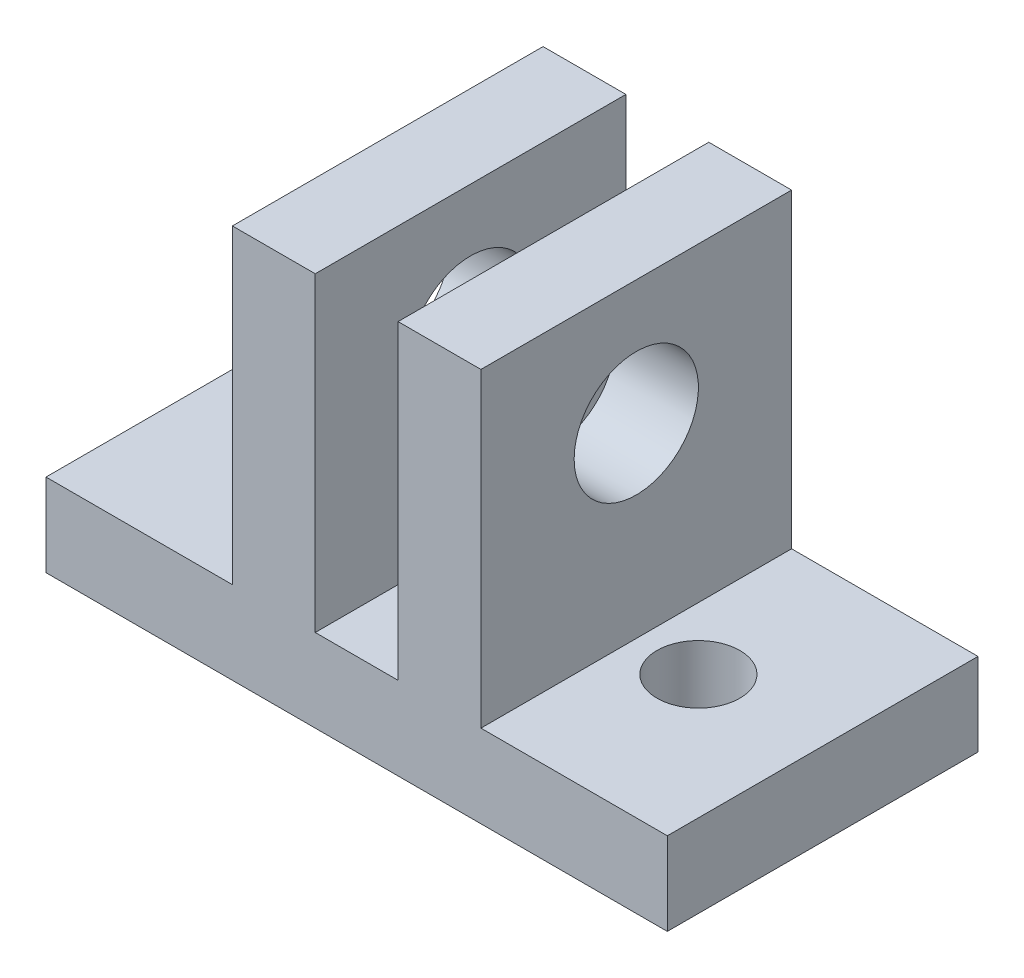
ISO-10303-21;
HEADER;
FILE_DESCRIPTION(('STEP AP214'),'2;1');
FILE_NAME('part.step','',(''),(''),'','','');
FILE_SCHEMA(('AUTOMOTIVE_DESIGN { 1 0 10303 214 1 1 1 1 }'));
ENDSEC;
DATA;
#1=APPLICATION_CONTEXT('core data for automotive mechanical design processes');
#2=APPLICATION_PROTOCOL_DEFINITION('international standard','automotive_design',2000,#1);
#3=PRODUCT_CONTEXT('',#1,'mechanical');
#4=PRODUCT('Part','Part','',(#3));
#5=PRODUCT_RELATED_PRODUCT_CATEGORY('part','',(#4));
#6=PRODUCT_DEFINITION_FORMATION('','',#4);
#7=PRODUCT_DEFINITION_CONTEXT('part definition',#1,'design');
#8=PRODUCT_DEFINITION('design','',#6,#7);
#9=PRODUCT_DEFINITION_SHAPE('','',#8);
#10=(LENGTH_UNIT() NAMED_UNIT(*) SI_UNIT(.MILLI.,.METRE.));
#11=(NAMED_UNIT(*) PLANE_ANGLE_UNIT() SI_UNIT($,.RADIAN.));
#12=(NAMED_UNIT(*) SI_UNIT($,.STERADIAN.) SOLID_ANGLE_UNIT());
#13=UNCERTAINTY_MEASURE_WITH_UNIT(LENGTH_MEASURE(1.E-05),#10,'distance_accuracy_value','');
#14=(GEOMETRIC_REPRESENTATION_CONTEXT(3) GLOBAL_UNCERTAINTY_ASSIGNED_CONTEXT((#13)) GLOBAL_UNIT_ASSIGNED_CONTEXT((#10,
#11,#12)) REPRESENTATION_CONTEXT('',''));
#15=CARTESIAN_POINT('',(0.,0.,0.));
#16=DIRECTION('',(0.,0.,1.));
#17=DIRECTION('',(1.,0.,0.));
#18=AXIS2_PLACEMENT_3D('',#15,#16,#17);
#19=CARTESIAN_POINT('',(0.,4.,0.));
#20=DIRECTION('',(0.,-1.,0.));
#21=DIRECTION('',(0.,0.,-1.));
#22=AXIS2_PLACEMENT_3D('',#19,#20,#21);
#23=PLANE('',#22);
#24=DIRECTION('',(0.,0.,1.));
#25=VECTOR('',#24,1.);
#26=CARTESIAN_POINT('',(17.,4.,-15.));
#27=LINE('',#26,#25);
#28=CARTESIAN_POINT('',(17.,4.,-15.));
#29=VERTEX_POINT('',#28);
#30=CARTESIAN_POINT('',(17.,4.,0.));
#31=VERTEX_POINT('',#30);
#32=EDGE_CURVE('E148',#29,#31,#27,.T.);
#33=ORIENTED_EDGE('',*,*,#32,.F.);
#34=DIRECTION('',(-1.,0.,0.));
#35=VECTOR('',#34,1.);
#36=CARTESIAN_POINT('',(0.,4.,-15.));
#37=LINE('',#36,#35);
#38=CARTESIAN_POINT('',(13.,4.,-15.));
#39=VERTEX_POINT('',#38);
#40=EDGE_CURVE('E181',#29,#39,#37,.T.);
#41=ORIENTED_EDGE('',*,*,#40,.T.);
#42=DIRECTION('',(0.,0.,-1.));
#43=VECTOR('',#42,1.);
#44=CARTESIAN_POINT('',(13.,4.,-15.));
#45=LINE('',#44,#43);
#46=CARTESIAN_POINT('',(13.,4.,0.));
#47=VERTEX_POINT('',#46);
#48=EDGE_CURVE('E152',#47,#39,#45,.T.);
#49=ORIENTED_EDGE('',*,*,#48,.F.);
#50=DIRECTION('',(1.,0.,0.));
#51=VECTOR('',#50,1.);
#52=CARTESIAN_POINT('',(0.,4.,0.));
#53=LINE('',#52,#51);
#54=EDGE_CURVE('E60',#47,#31,#53,.T.);
#55=ORIENTED_EDGE('',*,*,#54,.T.);
#56=EDGE_LOOP('',(#33,#41,#49,#55));
#57=FACE_BOUND('',#56,.T.);
#58=ADVANCED_FACE('F35',(#57),#23,.F.);
#59=CARTESIAN_POINT('',(24.,4.,-7.5));
#60=DIRECTION('',(0.,-1.,0.));
#61=DIRECTION('',(0.,0.,-1.));
#62=AXIS2_PLACEMENT_3D('',#59,#60,#61);
#63=CIRCLE('',#62,2.);
#64=CARTESIAN_POINT('',(24.,4.,-9.5));
#65=VERTEX_POINT('',#64);
#66=EDGE_CURVE('E282',#65,#65,#63,.T.);
#67=ORIENTED_EDGE('',*,*,#66,.T.);
#68=EDGE_LOOP('',(#67));
#69=FACE_BOUND('',#68,.T.);
#70=DIRECTION('',(0.,0.,-1.));
#71=VECTOR('',#70,1.);
#72=CARTESIAN_POINT('',(21.,4.,-15.));
#73=LINE('',#72,#71);
#74=CARTESIAN_POINT('',(21.,4.,0.));
#75=VERTEX_POINT('',#74);
#76=CARTESIAN_POINT('',(21.,4.,-15.));
#77=VERTEX_POINT('',#76);
#78=EDGE_CURVE('E52',#75,#77,#73,.T.);
#79=ORIENTED_EDGE('',*,*,#78,.F.);
#80=CARTESIAN_POINT('',(30.,4.,0.));
#81=VERTEX_POINT('',#80);
#82=EDGE_CURVE('E185',#75,#81,#53,.T.);
#83=ORIENTED_EDGE('',*,*,#82,.T.);
#84=DIRECTION('',(0.,0.,-1.));
#85=VECTOR('',#84,1.);
#86=CARTESIAN_POINT('',(30.,4.,0.));
#87=LINE('',#86,#85);
#88=CARTESIAN_POINT('',(30.,4.,-15.));
#89=VERTEX_POINT('',#88);
#90=EDGE_CURVE('E190',#81,#89,#87,.T.);
#91=ORIENTED_EDGE('',*,*,#90,.T.);
#92=EDGE_CURVE('E183',#89,#77,#37,.T.);
#93=ORIENTED_EDGE('',*,*,#92,.T.);
#94=EDGE_LOOP('',(#79,#83,#91,#93));
#95=FACE_BOUND('',#94,.T.);
#96=ADVANCED_FACE('F264',(#69,#95),#23,.F.);
#97=CARTESIAN_POINT('',(6.,4.,-7.5));
#98=DIRECTION('',(0.,-1.,0.));
#99=DIRECTION('',(0.,0.,-1.));
#100=AXIS2_PLACEMENT_3D('',#97,#98,#99);
#101=CIRCLE('',#100,2.);
#102=CARTESIAN_POINT('',(6.,4.,-9.5));
#103=VERTEX_POINT('',#102);
#104=EDGE_CURVE('E274',#103,#103,#101,.T.);
#105=ORIENTED_EDGE('',*,*,#104,.T.);
#106=EDGE_LOOP('',(#105));
#107=FACE_BOUND('',#106,.T.);
#108=DIRECTION('',(0.,0.,1.));
#109=VECTOR('',#108,1.);
#110=CARTESIAN_POINT('',(9.,4.,-15.));
#111=LINE('',#110,#109);
#112=CARTESIAN_POINT('',(9.,4.,-15.));
#113=VERTEX_POINT('',#112);
#114=CARTESIAN_POINT('',(9.,4.,0.));
#115=VERTEX_POINT('',#114);
#116=EDGE_CURVE('E149',#113,#115,#111,.T.);
#117=ORIENTED_EDGE('',*,*,#116,.F.);
#118=CARTESIAN_POINT('',(0.,4.,-15.));
#119=VERTEX_POINT('',#118);
#120=EDGE_CURVE('E184',#113,#119,#37,.T.);
#121=ORIENTED_EDGE('',*,*,#120,.T.);
#122=DIRECTION('',(0.,0.,1.));
#123=VECTOR('',#122,1.);
#124=CARTESIAN_POINT('',(0.,4.,0.));
#125=LINE('',#124,#123);
#126=CARTESIAN_POINT('',(0.,4.,0.));
#127=VERTEX_POINT('',#126);
#128=EDGE_CURVE('E203',#119,#127,#125,.T.);
#129=ORIENTED_EDGE('',*,*,#128,.T.);
#130=EDGE_CURVE('E201',#127,#115,#53,.T.);
#131=ORIENTED_EDGE('',*,*,#130,.T.);
#132=EDGE_LOOP('',(#117,#121,#129,#131));
#133=FACE_BOUND('',#132,.T.);
#134=ADVANCED_FACE('F263',(#107,#133),#23,.F.);
#135=CARTESIAN_POINT('',(0.,4.,0.));
#136=DIRECTION('',(1.,0.,0.));
#137=DIRECTION('',(0.,0.,-1.));
#138=AXIS2_PLACEMENT_3D('',#135,#136,#137);
#139=PLANE('',#138);
#140=DIRECTION('',(0.,0.,1.));
#141=VECTOR('',#140,1.);
#142=CARTESIAN_POINT('',(0.,0.,0.));
#143=LINE('',#142,#141);
#144=CARTESIAN_POINT('',(0.,0.,-15.));
#145=VERTEX_POINT('',#144);
#146=CARTESIAN_POINT('',(0.,0.,0.));
#147=VERTEX_POINT('',#146);
#148=EDGE_CURVE('E191',#145,#147,#143,.T.);
#149=ORIENTED_EDGE('',*,*,#148,.T.);
#150=DIRECTION('',(0.,-1.,0.));
#151=VECTOR('',#150,1.);
#152=CARTESIAN_POINT('',(0.,4.,0.));
#153=LINE('',#152,#151);
#154=EDGE_CURVE('E11',#127,#147,#153,.T.);
#155=ORIENTED_EDGE('',*,*,#154,.F.);
#156=ORIENTED_EDGE('',*,*,#128,.F.);
#157=DIRECTION('',(0.,-1.,0.));
#158=VECTOR('',#157,1.);
#159=CARTESIAN_POINT('',(0.,4.,-15.));
#160=LINE('',#159,#158);
#161=EDGE_CURVE('E199',#119,#145,#160,.T.);
#162=ORIENTED_EDGE('',*,*,#161,.T.);
#163=EDGE_LOOP('',(#149,#155,#156,#162));
#164=FACE_BOUND('',#163,.T.);
#165=ADVANCED_FACE('F37',(#164),#139,.F.);
#166=CARTESIAN_POINT('',(0.,4.,0.));
#167=DIRECTION('',(0.,0.,-1.));
#168=DIRECTION('',(-1.,0.,0.));
#169=AXIS2_PLACEMENT_3D('',#166,#167,#168);
#170=PLANE('',#169);
#171=DIRECTION('',(1.,0.,0.));
#172=VECTOR('',#171,1.);
#173=CARTESIAN_POINT('',(0.,0.,0.));
#174=LINE('',#173,#172);
#175=CARTESIAN_POINT('',(30.,0.,0.));
#176=VERTEX_POINT('',#175);
#177=EDGE_CURVE('E218',#147,#176,#174,.T.);
#178=ORIENTED_EDGE('',*,*,#177,.T.);
#179=DIRECTION('',(0.,-1.,0.));
#180=VECTOR('',#179,1.);
#181=CARTESIAN_POINT('',(30.,4.,0.));
#182=LINE('',#181,#180);
#183=EDGE_CURVE('E44',#81,#176,#182,.T.);
#184=ORIENTED_EDGE('',*,*,#183,.F.);
#185=ORIENTED_EDGE('',*,*,#82,.F.);
#186=DIRECTION('',(0.,-1.,0.));
#187=VECTOR('',#186,1.);
#188=CARTESIAN_POINT('',(21.,19.,0.));
#189=LINE('',#188,#187);
#190=CARTESIAN_POINT('',(21.,19.,0.));
#191=VERTEX_POINT('',#190);
#192=EDGE_CURVE('E133',#191,#75,#189,.T.);
#193=ORIENTED_EDGE('',*,*,#192,.F.);
#194=DIRECTION('',(1.,0.,0.));
#195=VECTOR('',#194,1.);
#196=CARTESIAN_POINT('',(17.,19.,0.));
#197=LINE('',#196,#195);
#198=CARTESIAN_POINT('',(17.,19.,0.));
#199=VERTEX_POINT('',#198);
#200=EDGE_CURVE('E126',#199,#191,#197,.T.);
#201=ORIENTED_EDGE('',*,*,#200,.F.);
#202=DIRECTION('',(0.,-1.,0.));
#203=VECTOR('',#202,1.);
#204=CARTESIAN_POINT('',(17.,19.,0.));
#205=LINE('',#204,#203);
#206=EDGE_CURVE('E130',#199,#31,#205,.T.);
#207=ORIENTED_EDGE('',*,*,#206,.T.);
#208=ORIENTED_EDGE('',*,*,#54,.F.);
#209=DIRECTION('',(0.,-1.,0.));
#210=VECTOR('',#209,1.);
#211=CARTESIAN_POINT('',(13.,19.,0.));
#212=LINE('',#211,#210);
#213=CARTESIAN_POINT('',(13.,19.,0.));
#214=VERTEX_POINT('',#213);
#215=EDGE_CURVE('E238',#214,#47,#212,.T.);
#216=ORIENTED_EDGE('',*,*,#215,.F.);
#217=DIRECTION('',(1.,0.,0.));
#218=VECTOR('',#217,1.);
#219=CARTESIAN_POINT('',(9.,19.,0.));
#220=LINE('',#219,#218);
#221=CARTESIAN_POINT('',(9.,19.,0.));
#222=VERTEX_POINT('',#221);
#223=EDGE_CURVE('E161',#222,#214,#220,.T.);
#224=ORIENTED_EDGE('',*,*,#223,.F.);
#225=DIRECTION('',(0.,-1.,0.));
#226=VECTOR('',#225,1.);
#227=CARTESIAN_POINT('',(9.,19.,0.));
#228=LINE('',#227,#226);
#229=EDGE_CURVE('E236',#222,#115,#228,.T.);
#230=ORIENTED_EDGE('',*,*,#229,.T.);
#231=ORIENTED_EDGE('',*,*,#130,.F.);
#232=ORIENTED_EDGE('',*,*,#154,.T.);
#233=EDGE_LOOP('',(#178,#184,#185,#193,#201,#207,#208,#216,#224,#230,#231,#232));
#234=FACE_BOUND('',#233,.T.);
#235=ADVANCED_FACE('F128',(#234),#170,.F.);
#236=CARTESIAN_POINT('',(30.,4.,0.));
#237=DIRECTION('',(-1.,0.,0.));
#238=DIRECTION('',(0.,0.,1.));
#239=AXIS2_PLACEMENT_3D('',#236,#237,#238);
#240=PLANE('',#239);
#241=DIRECTION('',(0.,0.,-1.));
#242=VECTOR('',#241,1.);
#243=CARTESIAN_POINT('',(30.,0.,0.));
#244=LINE('',#243,#242);
#245=CARTESIAN_POINT('',(30.,0.,-15.));
#246=VERTEX_POINT('',#245);
#247=EDGE_CURVE('E211',#176,#246,#244,.T.);
#248=ORIENTED_EDGE('',*,*,#247,.T.);
#249=DIRECTION('',(0.,-1.,0.));
#250=VECTOR('',#249,1.);
#251=CARTESIAN_POINT('',(30.,4.,-15.));
#252=LINE('',#251,#250);
#253=EDGE_CURVE('E222',#89,#246,#252,.T.);
#254=ORIENTED_EDGE('',*,*,#253,.F.);
#255=ORIENTED_EDGE('',*,*,#90,.F.);
#256=ORIENTED_EDGE('',*,*,#183,.T.);
#257=EDGE_LOOP('',(#248,#254,#255,#256));
#258=FACE_BOUND('',#257,.T.);
#259=ADVANCED_FACE('F229',(#258),#240,.F.);
#260=CARTESIAN_POINT('',(0.,4.,-15.));
#261=DIRECTION('',(0.,0.,1.));
#262=DIRECTION('',(1.,0.,0.));
#263=AXIS2_PLACEMENT_3D('',#260,#261,#262);
#264=PLANE('',#263);
#265=DIRECTION('',(-1.,0.,0.));
#266=VECTOR('',#265,1.);
#267=CARTESIAN_POINT('',(0.,0.,-15.));
#268=LINE('',#267,#266);
#269=EDGE_CURVE('E207',#246,#145,#268,.T.);
#270=ORIENTED_EDGE('',*,*,#269,.T.);
#271=ORIENTED_EDGE('',*,*,#161,.F.);
#272=ORIENTED_EDGE('',*,*,#120,.F.);
#273=DIRECTION('',(0.,-1.,0.));
#274=VECTOR('',#273,1.);
#275=CARTESIAN_POINT('',(9.,19.,-15.));
#276=LINE('',#275,#274);
#277=CARTESIAN_POINT('',(9.,19.,-15.));
#278=VERTEX_POINT('',#277);
#279=EDGE_CURVE('E167',#278,#113,#276,.T.);
#280=ORIENTED_EDGE('',*,*,#279,.F.);
#281=DIRECTION('',(-1.,0.,0.));
#282=VECTOR('',#281,1.);
#283=CARTESIAN_POINT('',(9.,19.,-15.));
#284=LINE('',#283,#282);
#285=CARTESIAN_POINT('',(13.,19.,-15.));
#286=VERTEX_POINT('',#285);
#287=EDGE_CURVE('E165',#286,#278,#284,.T.);
#288=ORIENTED_EDGE('',*,*,#287,.F.);
#289=DIRECTION('',(0.,-1.,0.));
#290=VECTOR('',#289,1.);
#291=CARTESIAN_POINT('',(13.,19.,-15.));
#292=LINE('',#291,#290);
#293=EDGE_CURVE('E178',#286,#39,#292,.T.);
#294=ORIENTED_EDGE('',*,*,#293,.T.);
#295=ORIENTED_EDGE('',*,*,#40,.F.);
#296=DIRECTION('',(0.,-1.,0.));
#297=VECTOR('',#296,1.);
#298=CARTESIAN_POINT('',(17.,19.,-15.));
#299=LINE('',#298,#297);
#300=CARTESIAN_POINT('',(17.,19.,-15.));
#301=VERTEX_POINT('',#300);
#302=EDGE_CURVE('E269',#301,#29,#299,.T.);
#303=ORIENTED_EDGE('',*,*,#302,.F.);
#304=DIRECTION('',(-1.,0.,0.));
#305=VECTOR('',#304,1.);
#306=CARTESIAN_POINT('',(17.,19.,-15.));
#307=LINE('',#306,#305);
#308=CARTESIAN_POINT('',(21.,19.,-15.));
#309=VERTEX_POINT('',#308);
#310=EDGE_CURVE('E142',#309,#301,#307,.T.);
#311=ORIENTED_EDGE('',*,*,#310,.F.);
#312=DIRECTION('',(0.,-1.,0.));
#313=VECTOR('',#312,1.);
#314=CARTESIAN_POINT('',(21.,19.,-15.));
#315=LINE('',#314,#313);
#316=EDGE_CURVE('E154',#309,#77,#315,.T.);
#317=ORIENTED_EDGE('',*,*,#316,.T.);
#318=ORIENTED_EDGE('',*,*,#92,.F.);
#319=ORIENTED_EDGE('',*,*,#253,.T.);
#320=EDGE_LOOP('',(#270,#271,#272,#280,#288,#294,#295,#303,#311,#317,#318,#319));
#321=FACE_BOUND('',#320,.T.);
#322=ADVANCED_FACE('F255',(#321),#264,.F.);
#323=CARTESIAN_POINT('',(0.,0.,0.));
#324=DIRECTION('',(0.,-1.,0.));
#325=DIRECTION('',(0.,0.,-1.));
#326=AXIS2_PLACEMENT_3D('',#323,#324,#325);
#327=PLANE('',#326);
#328=CARTESIAN_POINT('',(24.,0.,-7.5));
#329=DIRECTION('',(0.,-1.,0.));
#330=DIRECTION('',(0.,0.,-1.));
#331=AXIS2_PLACEMENT_3D('',#328,#329,#330);
#332=CIRCLE('',#331,2.);
#333=CARTESIAN_POINT('',(24.,0.,-9.5));
#334=VERTEX_POINT('',#333);
#335=EDGE_CURVE('E285',#334,#334,#332,.T.);
#336=ORIENTED_EDGE('',*,*,#335,.F.);
#337=EDGE_LOOP('',(#336));
#338=FACE_BOUND('',#337,.T.);
#339=CARTESIAN_POINT('',(6.,0.,-7.5));
#340=DIRECTION('',(0.,-1.,0.));
#341=DIRECTION('',(0.,0.,-1.));
#342=AXIS2_PLACEMENT_3D('',#339,#340,#341);
#343=CIRCLE('',#342,2.);
#344=CARTESIAN_POINT('',(6.,0.,-9.5));
#345=VERTEX_POINT('',#344);
#346=EDGE_CURVE('E279',#345,#345,#343,.T.);
#347=ORIENTED_EDGE('',*,*,#346,.F.);
#348=EDGE_LOOP('',(#347));
#349=FACE_BOUND('',#348,.T.);
#350=ORIENTED_EDGE('',*,*,#148,.F.);
#351=ORIENTED_EDGE('',*,*,#269,.F.);
#352=ORIENTED_EDGE('',*,*,#247,.F.);
#353=ORIENTED_EDGE('',*,*,#177,.F.);
#354=EDGE_LOOP('',(#350,#351,#352,#353));
#355=FACE_BOUND('',#354,.T.);
#356=ADVANCED_FACE('F233',(#338,#349,#355),#327,.T.);
#357=CARTESIAN_POINT('',(9.,19.,-15.));
#358=DIRECTION('',(1.,0.,0.));
#359=DIRECTION('',(0.,0.,-1.));
#360=AXIS2_PLACEMENT_3D('',#357,#358,#359);
#361=PLANE('',#360);
#362=CARTESIAN_POINT('',(9.,13.,-7.5));
#363=DIRECTION('',(-1.,0.,0.));
#364=DIRECTION('',(0.,0.,1.));
#365=AXIS2_PLACEMENT_3D('',#362,#363,#364);
#366=CIRCLE('',#365,3.);
#367=CARTESIAN_POINT('',(9.,13.,-4.5));
#368=VERTEX_POINT('',#367);
#369=EDGE_CURVE('E294',#368,#368,#366,.T.);
#370=ORIENTED_EDGE('',*,*,#369,.F.);
#371=EDGE_LOOP('',(#370));
#372=FACE_BOUND('',#371,.T.);
#373=ORIENTED_EDGE('',*,*,#116,.T.);
#374=ORIENTED_EDGE('',*,*,#229,.F.);
#375=DIRECTION('',(0.,0.,1.));
#376=VECTOR('',#375,1.);
#377=CARTESIAN_POINT('',(9.,19.,-15.));
#378=LINE('',#377,#376);
#379=EDGE_CURVE('E158',#278,#222,#378,.T.);
#380=ORIENTED_EDGE('',*,*,#379,.F.);
#381=ORIENTED_EDGE('',*,*,#279,.T.);
#382=EDGE_LOOP('',(#373,#374,#380,#381));
#383=FACE_BOUND('',#382,.T.);
#384=ADVANCED_FACE('F262',(#372,#383),#361,.F.);
#385=CARTESIAN_POINT('',(13.,19.,-15.));
#386=DIRECTION('',(-1.,0.,0.));
#387=DIRECTION('',(0.,0.,1.));
#388=AXIS2_PLACEMENT_3D('',#385,#386,#387);
#389=PLANE('',#388);
#390=CARTESIAN_POINT('',(13.,13.,-7.5));
#391=DIRECTION('',(-1.,0.,0.));
#392=DIRECTION('',(0.,0.,1.));
#393=AXIS2_PLACEMENT_3D('',#390,#391,#392);
#394=CIRCLE('',#393,3.);
#395=CARTESIAN_POINT('',(13.,13.,-4.5));
#396=VERTEX_POINT('',#395);
#397=EDGE_CURVE('E288',#396,#396,#394,.T.);
#398=ORIENTED_EDGE('',*,*,#397,.T.);
#399=EDGE_LOOP('',(#398));
#400=FACE_BOUND('',#399,.T.);
#401=ORIENTED_EDGE('',*,*,#48,.T.);
#402=ORIENTED_EDGE('',*,*,#293,.F.);
#403=DIRECTION('',(0.,0.,-1.));
#404=VECTOR('',#403,1.);
#405=CARTESIAN_POINT('',(13.,19.,-15.));
#406=LINE('',#405,#404);
#407=EDGE_CURVE('E163',#214,#286,#406,.T.);
#408=ORIENTED_EDGE('',*,*,#407,.F.);
#409=ORIENTED_EDGE('',*,*,#215,.T.);
#410=EDGE_LOOP('',(#401,#402,#408,#409));
#411=FACE_BOUND('',#410,.T.);
#412=ADVANCED_FACE('F251',(#400,#411),#389,.F.);
#413=CARTESIAN_POINT('',(0.,19.,0.));
#414=DIRECTION('',(0.,1.,0.));
#415=DIRECTION('',(0.,0.,1.));
#416=AXIS2_PLACEMENT_3D('',#413,#414,#415);
#417=PLANE('',#416);
#418=ORIENTED_EDGE('',*,*,#379,.T.);
#419=ORIENTED_EDGE('',*,*,#223,.T.);
#420=ORIENTED_EDGE('',*,*,#407,.T.);
#421=ORIENTED_EDGE('',*,*,#287,.T.);
#422=EDGE_LOOP('',(#418,#419,#420,#421));
#423=FACE_BOUND('',#422,.T.);
#424=ADVANCED_FACE('F260',(#423),#417,.T.);
#425=CARTESIAN_POINT('',(17.,19.,-15.));
#426=DIRECTION('',(1.,0.,0.));
#427=DIRECTION('',(0.,0.,-1.));
#428=AXIS2_PLACEMENT_3D('',#425,#426,#427);
#429=PLANE('',#428);
#430=CARTESIAN_POINT('',(17.,13.,-7.5));
#431=DIRECTION('',(1.,0.,0.));
#432=DIRECTION('',(0.,0.,-1.));
#433=AXIS2_PLACEMENT_3D('',#430,#431,#432);
#434=CIRCLE('',#433,3.);
#435=CARTESIAN_POINT('',(17.,13.,-10.5));
#436=VERTEX_POINT('',#435);
#437=EDGE_CURVE('E291',#436,#436,#434,.T.);
#438=ORIENTED_EDGE('',*,*,#437,.T.);
#439=EDGE_LOOP('',(#438));
#440=FACE_BOUND('',#439,.T.);
#441=ORIENTED_EDGE('',*,*,#32,.T.);
#442=ORIENTED_EDGE('',*,*,#206,.F.);
#443=DIRECTION('',(0.,0.,1.));
#444=VECTOR('',#443,1.);
#445=CARTESIAN_POINT('',(17.,19.,-15.));
#446=LINE('',#445,#444);
#447=EDGE_CURVE('E137',#301,#199,#446,.T.);
#448=ORIENTED_EDGE('',*,*,#447,.F.);
#449=ORIENTED_EDGE('',*,*,#302,.T.);
#450=EDGE_LOOP('',(#441,#442,#448,#449));
#451=FACE_BOUND('',#450,.T.);
#452=ADVANCED_FACE('F147',(#440,#451),#429,.F.);
#453=CARTESIAN_POINT('',(21.,19.,-15.));
#454=DIRECTION('',(-1.,0.,0.));
#455=DIRECTION('',(0.,0.,1.));
#456=AXIS2_PLACEMENT_3D('',#453,#454,#455);
#457=PLANE('',#456);
#458=CARTESIAN_POINT('',(21.,13.,-7.5));
#459=DIRECTION('',(-1.,0.,0.));
#460=DIRECTION('',(0.,0.,1.));
#461=AXIS2_PLACEMENT_3D('',#458,#459,#460);
#462=CIRCLE('',#461,3.);
#463=CARTESIAN_POINT('',(21.,13.,-4.5));
#464=VERTEX_POINT('',#463);
#465=EDGE_CURVE('E39',#464,#464,#462,.T.);
#466=ORIENTED_EDGE('',*,*,#465,.T.);
#467=EDGE_LOOP('',(#466));
#468=FACE_BOUND('',#467,.T.);
#469=ORIENTED_EDGE('',*,*,#78,.T.);
#470=ORIENTED_EDGE('',*,*,#316,.F.);
#471=DIRECTION('',(0.,0.,-1.));
#472=VECTOR('',#471,1.);
#473=CARTESIAN_POINT('',(21.,19.,-15.));
#474=LINE('',#473,#472);
#475=EDGE_CURVE('E136',#191,#309,#474,.T.);
#476=ORIENTED_EDGE('',*,*,#475,.F.);
#477=ORIENTED_EDGE('',*,*,#192,.T.);
#478=EDGE_LOOP('',(#469,#470,#476,#477));
#479=FACE_BOUND('',#478,.T.);
#480=ADVANCED_FACE('F301',(#468,#479),#457,.F.);
#481=CARTESIAN_POINT('',(0.,19.,0.));
#482=DIRECTION('',(0.,1.,0.));
#483=DIRECTION('',(0.,0.,1.));
#484=AXIS2_PLACEMENT_3D('',#481,#482,#483);
#485=PLANE('',#484);
#486=ORIENTED_EDGE('',*,*,#447,.T.);
#487=ORIENTED_EDGE('',*,*,#200,.T.);
#488=ORIENTED_EDGE('',*,*,#475,.T.);
#489=ORIENTED_EDGE('',*,*,#310,.T.);
#490=EDGE_LOOP('',(#486,#487,#488,#489));
#491=FACE_BOUND('',#490,.T.);
#492=ADVANCED_FACE('F140',(#491),#485,.T.);
#493=CARTESIAN_POINT('',(6.,15.,-7.5));
#494=DIRECTION('',(0.,-1.,0.));
#495=DIRECTION('',(0.,0.,-1.));
#496=AXIS2_PLACEMENT_3D('',#493,#494,#495);
#497=CYLINDRICAL_SURFACE('',#496,2.);
#498=ORIENTED_EDGE('',*,*,#346,.T.);
#499=EDGE_LOOP('',(#498));
#500=FACE_BOUND('',#499,.T.);
#501=ORIENTED_EDGE('',*,*,#104,.F.);
#502=EDGE_LOOP('',(#501));
#503=FACE_BOUND('',#502,.T.);
#504=ADVANCED_FACE('F334',(#500,#503),#497,.F.);
#505=CARTESIAN_POINT('',(24.,15.,-7.5));
#506=DIRECTION('',(0.,-1.,0.));
#507=DIRECTION('',(0.,0.,-1.));
#508=AXIS2_PLACEMENT_3D('',#505,#506,#507);
#509=CYLINDRICAL_SURFACE('',#508,2.);
#510=ORIENTED_EDGE('',*,*,#335,.T.);
#511=EDGE_LOOP('',(#510));
#512=FACE_BOUND('',#511,.T.);
#513=ORIENTED_EDGE('',*,*,#66,.F.);
#514=EDGE_LOOP('',(#513));
#515=FACE_BOUND('',#514,.T.);
#516=ADVANCED_FACE('F307',(#512,#515),#509,.F.);
#517=CARTESIAN_POINT('',(24.,13.,-7.5));
#518=DIRECTION('',(-1.,0.,0.));
#519=DIRECTION('',(0.,0.,1.));
#520=AXIS2_PLACEMENT_3D('',#517,#518,#519);
#521=CYLINDRICAL_SURFACE('',#520,3.);
#522=ORIENTED_EDGE('',*,*,#465,.F.);
#523=EDGE_LOOP('',(#522));
#524=FACE_BOUND('',#523,.T.);
#525=ORIENTED_EDGE('',*,*,#437,.F.);
#526=EDGE_LOOP('',(#525));
#527=FACE_BOUND('',#526,.T.);
#528=ADVANCED_FACE('F303',(#524,#527),#521,.F.);
#529=ORIENTED_EDGE('',*,*,#369,.T.);
#530=EDGE_LOOP('',(#529));
#531=FACE_BOUND('',#530,.T.);
#532=ORIENTED_EDGE('',*,*,#397,.F.);
#533=EDGE_LOOP('',(#532));
#534=FACE_BOUND('',#533,.T.);
#535=ADVANCED_FACE('F306',(#531,#534),#521,.F.);
#536=CLOSED_SHELL('',(#58,#96,#134,#165,#235,#259,#322,#356,#384,#412,#424,#452,#480,#492,#504,
#516,#528,#535));
#537=MANIFOLD_SOLID_BREP('B2',#536);
#538=ADVANCED_BREP_SHAPE_REPRESENTATION('',(#18,#537),#14);
#539=SHAPE_DEFINITION_REPRESENTATION(#9,#538);
ENDSEC;
END-ISO-10303-21;
